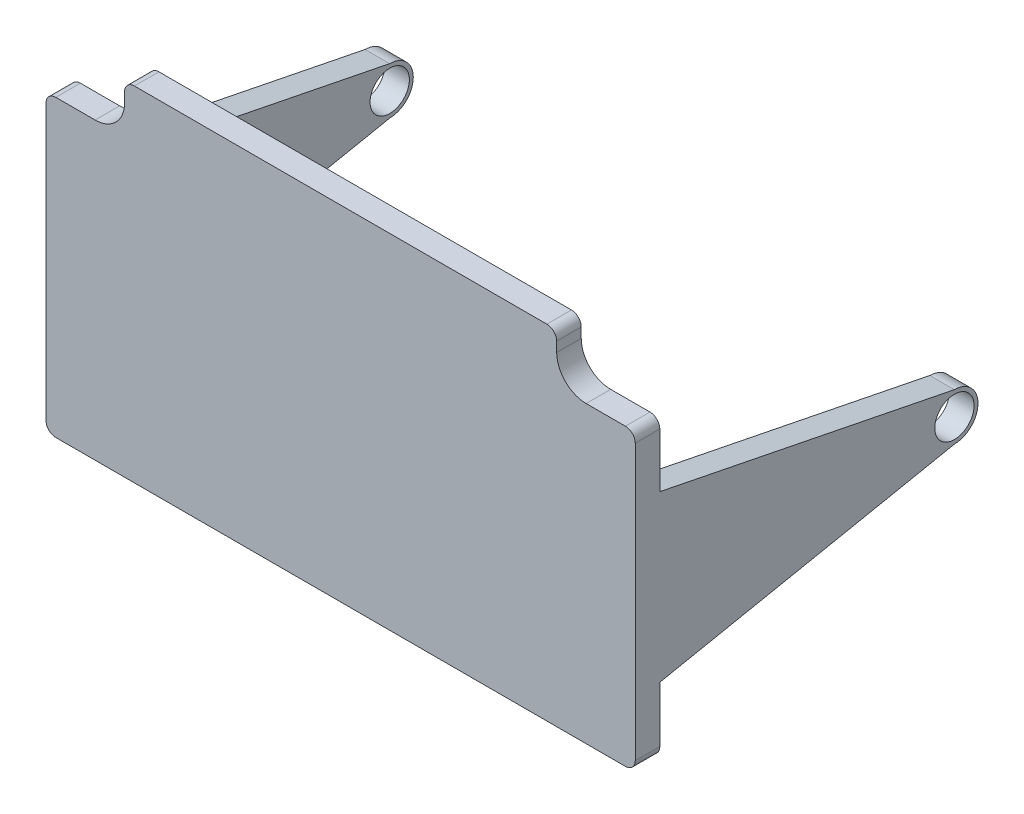
ISO-10303-21;
HEADER;
FILE_DESCRIPTION(('STEP AP214'),'2;1');
FILE_NAME('part.step','',(''),(''),'','','');
FILE_SCHEMA(('AUTOMOTIVE_DESIGN { 1 0 10303 214 1 1 1 1 }'));
ENDSEC;
DATA;
#1=APPLICATION_CONTEXT('core data for automotive mechanical design processes');
#2=APPLICATION_PROTOCOL_DEFINITION('international standard','automotive_design',2000,#1);
#3=PRODUCT_CONTEXT('',#1,'mechanical');
#4=PRODUCT('Part','Part','',(#3));
#5=PRODUCT_RELATED_PRODUCT_CATEGORY('part','',(#4));
#6=PRODUCT_DEFINITION_FORMATION('','',#4);
#7=PRODUCT_DEFINITION_CONTEXT('part definition',#1,'design');
#8=PRODUCT_DEFINITION('design','',#6,#7);
#9=PRODUCT_DEFINITION_SHAPE('','',#8);
#10=(LENGTH_UNIT() NAMED_UNIT(*) SI_UNIT(.MILLI.,.METRE.));
#11=(NAMED_UNIT(*) PLANE_ANGLE_UNIT() SI_UNIT($,.RADIAN.));
#12=(NAMED_UNIT(*) SI_UNIT($,.STERADIAN.) SOLID_ANGLE_UNIT());
#13=UNCERTAINTY_MEASURE_WITH_UNIT(LENGTH_MEASURE(1.E-05),#10,'distance_accuracy_value','');
#14=(GEOMETRIC_REPRESENTATION_CONTEXT(3) GLOBAL_UNCERTAINTY_ASSIGNED_CONTEXT((#13)) GLOBAL_UNIT_ASSIGNED_CONTEXT((#10,
#11,#12)) REPRESENTATION_CONTEXT('',''));
#15=CARTESIAN_POINT('',(0.,0.,0.));
#16=DIRECTION('',(0.,0.,1.));
#17=DIRECTION('',(1.,0.,0.));
#18=AXIS2_PLACEMENT_3D('',#15,#16,#17);
#19=CARTESIAN_POINT('',(0.,0.,-32.5));
#20=DIRECTION('',(0.,0.,-1.));
#21=DIRECTION('',(-1.,0.,0.));
#22=AXIS2_PLACEMENT_3D('',#19,#20,#21);
#23=PLANE('',#22);
#24=DIRECTION('',(-1.,0.,0.));
#25=VECTOR('',#24,1.);
#26=CARTESIAN_POINT('',(-27.5,-2.32890700780279,-32.5));
#27=LINE('',#26,#25);
#28=CARTESIAN_POINT('',(-27.5,-2.32890700780279,-32.5));
#29=VERTEX_POINT('',#28);
#30=CARTESIAN_POINT('',(-30.,-2.32890700780279,-32.5));
#31=VERTEX_POINT('',#30);
#32=EDGE_CURVE('E49',#29,#31,#27,.T.);
#33=ORIENTED_EDGE('',*,*,#32,.F.);
#34=DIRECTION('',(0.,-1.,0.));
#35=VECTOR('',#34,1.);
#36=CARTESIAN_POINT('',(-27.5,2.47490839214315,-32.5));
#37=LINE('',#36,#35);
#38=CARTESIAN_POINT('',(-27.5,-2.33272240774873,-32.5));
#39=VERTEX_POINT('',#38);
#40=EDGE_CURVE('E234',#29,#39,#37,.T.);
#41=ORIENTED_EDGE('',*,*,#40,.T.);
#42=DIRECTION('',(-1.,0.,0.));
#43=VECTOR('',#42,1.);
#44=CARTESIAN_POINT('',(-27.5,-2.33272240774874,-32.5));
#45=LINE('',#44,#43);
#46=CARTESIAN_POINT('',(-30.,-2.33272240774874,-32.5));
#47=VERTEX_POINT('',#46);
#48=EDGE_CURVE('E221',#39,#47,#45,.T.);
#49=ORIENTED_EDGE('',*,*,#48,.T.);
#50=DIRECTION('',(0.,1.,0.));
#51=VECTOR('',#50,1.);
#52=CARTESIAN_POINT('',(-30.,-2.33272240774874,-32.5));
#53=LINE('',#52,#51);
#54=EDGE_CURVE('E243',#47,#31,#53,.T.);
#55=ORIENTED_EDGE('',*,*,#54,.T.);
#56=EDGE_LOOP('',(#33,#41,#49,#55));
#57=FACE_BOUND('',#56,.T.);
#58=ADVANCED_FACE('F33',(#57),#23,.T.);
#59=CARTESIAN_POINT('',(0.,0.,-32.5));
#60=DIRECTION('',(0.,0.,1.));
#61=DIRECTION('',(1.,0.,0.));
#62=AXIS2_PLACEMENT_3D('',#59,#60,#61);
#63=PLANE('',#62);
#64=DIRECTION('',(0.,1.,0.));
#65=VECTOR('',#64,1.);
#66=CARTESIAN_POINT('',(27.5,2.47490839214314,-32.5));
#67=LINE('',#66,#65);
#68=CARTESIAN_POINT('',(27.5,-2.33272240774873,-32.5));
#69=VERTEX_POINT('',#68);
#70=CARTESIAN_POINT('',(27.5,-2.32890700780279,-32.5));
#71=VERTEX_POINT('',#70);
#72=EDGE_CURVE('E436',#69,#71,#67,.T.);
#73=ORIENTED_EDGE('',*,*,#72,.T.);
#74=DIRECTION('',(1.,0.,0.));
#75=VECTOR('',#74,1.);
#76=CARTESIAN_POINT('',(27.5,-2.32890700780279,-32.5));
#77=LINE('',#76,#75);
#78=CARTESIAN_POINT('',(30.,-2.32890700780279,-32.5));
#79=VERTEX_POINT('',#78);
#80=EDGE_CURVE('E427',#71,#79,#77,.T.);
#81=ORIENTED_EDGE('',*,*,#80,.T.);
#82=DIRECTION('',(0.,-1.,0.));
#83=VECTOR('',#82,1.);
#84=CARTESIAN_POINT('',(30.,-2.33272240774873,-32.5));
#85=LINE('',#84,#83);
#86=CARTESIAN_POINT('',(30.,-2.33272240774873,-32.5));
#87=VERTEX_POINT('',#86);
#88=EDGE_CURVE('E442',#79,#87,#85,.T.);
#89=ORIENTED_EDGE('',*,*,#88,.T.);
#90=DIRECTION('',(-1.,0.,0.));
#91=VECTOR('',#90,1.);
#92=CARTESIAN_POINT('',(27.5,-2.33272240774873,-32.5));
#93=LINE('',#92,#91);
#94=EDGE_CURVE('E249',#87,#69,#93,.T.);
#95=ORIENTED_EDGE('',*,*,#94,.T.);
#96=EDGE_LOOP('',(#73,#81,#89,#95));
#97=FACE_BOUND('',#96,.T.);
#98=ADVANCED_FACE('F491',(#97),#63,.F.);
#99=CARTESIAN_POINT('',(25.,18.,-2.5));
#100=DIRECTION('',(0.,0.,-1.));
#101=DIRECTION('',(-1.,0.,0.));
#102=AXIS2_PLACEMENT_3D('',#99,#100,#101);
#103=PLANE('',#102);
#104=DIRECTION('',(-1.,0.,0.));
#105=VECTOR('',#104,1.);
#106=CARTESIAN_POINT('',(-27.5,-8.33272240774873,-2.5));
#107=LINE('',#106,#105);
#108=CARTESIAN_POINT('',(-27.5,-8.33272240774873,-2.5));
#109=VERTEX_POINT('',#108);
#110=CARTESIAN_POINT('',(-30.,-8.33272240774873,-2.5));
#111=VERTEX_POINT('',#110);
#112=EDGE_CURVE('E401',#109,#111,#107,.T.);
#113=ORIENTED_EDGE('',*,*,#112,.F.);
#114=DIRECTION('',(0.,-1.,0.));
#115=VECTOR('',#114,1.);
#116=CARTESIAN_POINT('',(-27.5,2.47490839214315,-2.5));
#117=LINE('',#116,#115);
#118=CARTESIAN_POINT('',(-27.5,8.47490839214315,-2.5));
#119=VERTEX_POINT('',#118);
#120=EDGE_CURVE('E237',#119,#109,#117,.T.);
#121=ORIENTED_EDGE('',*,*,#120,.F.);
#122=DIRECTION('',(-1.,0.,0.));
#123=VECTOR('',#122,1.);
#124=CARTESIAN_POINT('',(-27.5,8.47490839214315,-2.5));
#125=LINE('',#124,#123);
#126=CARTESIAN_POINT('',(-30.,8.47490839214315,-2.5));
#127=VERTEX_POINT('',#126);
#128=EDGE_CURVE('E404',#119,#127,#125,.T.);
#129=ORIENTED_EDGE('',*,*,#128,.T.);
#130=DIRECTION('',(0.,-1.,0.));
#131=VECTOR('',#130,1.);
#132=CARTESIAN_POINT('',(-30.,-15.,-2.5));
#133=LINE('',#132,#131);
#134=CARTESIAN_POINT('',(-30.,14.,-2.5));
#135=VERTEX_POINT('',#134);
#136=EDGE_CURVE('E255',#135,#127,#133,.T.);
#137=ORIENTED_EDGE('',*,*,#136,.F.);
#138=CARTESIAN_POINT('',(-29.,14.,-2.5));
#139=DIRECTION('',(0.,0.,-1.));
#140=DIRECTION('',(-1.,0.,0.));
#141=AXIS2_PLACEMENT_3D('',#138,#139,#140);
#142=CIRCLE('',#141,1.);
#143=CARTESIAN_POINT('',(-29.,15.,-2.5));
#144=VERTEX_POINT('',#143);
#145=EDGE_CURVE('E359',#135,#144,#142,.T.);
#146=ORIENTED_EDGE('',*,*,#145,.T.);
#147=DIRECTION('',(-1.,0.,0.));
#148=VECTOR('',#147,1.);
#149=CARTESIAN_POINT('',(-25.,15.,-2.5));
#150=LINE('',#149,#148);
#151=CARTESIAN_POINT('',(-25.,15.,-2.5));
#152=VERTEX_POINT('',#151);
#153=EDGE_CURVE('E250',#152,#144,#150,.T.);
#154=ORIENTED_EDGE('',*,*,#153,.F.);
#155=CARTESIAN_POINT('',(-25.,18.,-2.5));
#156=DIRECTION('',(0.,0.,-1.));
#157=DIRECTION('',(1.,0.,0.));
#158=AXIS2_PLACEMENT_3D('',#155,#156,#157);
#159=CIRCLE('',#158,3.);
#160=CARTESIAN_POINT('',(-22.,18.,-2.5));
#161=VERTEX_POINT('',#160);
#162=EDGE_CURVE('E278',#161,#152,#159,.T.);
#163=ORIENTED_EDGE('',*,*,#162,.F.);
#164=DIRECTION('',(0.,-1.,0.));
#165=VECTOR('',#164,1.);
#166=CARTESIAN_POINT('',(-22.,18.,-2.5));
#167=LINE('',#166,#165);
#168=CARTESIAN_POINT('',(-22.,19.,-2.5));
#169=VERTEX_POINT('',#168);
#170=EDGE_CURVE('E276',#169,#161,#167,.T.);
#171=ORIENTED_EDGE('',*,*,#170,.F.);
#172=CARTESIAN_POINT('',(-21.,19.,-2.5));
#173=DIRECTION('',(0.,0.,-1.));
#174=DIRECTION('',(-1.,0.,0.));
#175=AXIS2_PLACEMENT_3D('',#172,#173,#174);
#176=CIRCLE('',#175,1.);
#177=CARTESIAN_POINT('',(-21.,20.,-2.5));
#178=VERTEX_POINT('',#177);
#179=EDGE_CURVE('E329',#169,#178,#176,.T.);
#180=ORIENTED_EDGE('',*,*,#179,.T.);
#181=DIRECTION('',(-1.,0.,0.));
#182=VECTOR('',#181,1.);
#183=CARTESIAN_POINT('',(-22.,20.,-2.5));
#184=LINE('',#183,#182);
#185=CARTESIAN_POINT('',(21.,20.,-2.5));
#186=VERTEX_POINT('',#185);
#187=EDGE_CURVE('E273',#186,#178,#184,.T.);
#188=ORIENTED_EDGE('',*,*,#187,.F.);
#189=CARTESIAN_POINT('',(21.,19.,-2.5));
#190=DIRECTION('',(0.,0.,-1.));
#191=DIRECTION('',(-1.,0.,0.));
#192=AXIS2_PLACEMENT_3D('',#189,#190,#191);
#193=CIRCLE('',#192,1.);
#194=CARTESIAN_POINT('',(22.,19.,-2.5));
#195=VERTEX_POINT('',#194);
#196=EDGE_CURVE('E331',#186,#195,#193,.T.);
#197=ORIENTED_EDGE('',*,*,#196,.T.);
#198=DIRECTION('',(0.,1.,0.));
#199=VECTOR('',#198,1.);
#200=CARTESIAN_POINT('',(22.,20.,-2.5));
#201=LINE('',#200,#199);
#202=CARTESIAN_POINT('',(22.,18.,-2.5));
#203=VERTEX_POINT('',#202);
#204=EDGE_CURVE('E270',#203,#195,#201,.T.);
#205=ORIENTED_EDGE('',*,*,#204,.F.);
#206=CARTESIAN_POINT('',(25.,18.,-2.5));
#207=DIRECTION('',(0.,0.,-1.));
#208=DIRECTION('',(-1.,0.,0.));
#209=AXIS2_PLACEMENT_3D('',#206,#207,#208);
#210=CIRCLE('',#209,3.);
#211=CARTESIAN_POINT('',(25.,15.,-2.5));
#212=VERTEX_POINT('',#211);
#213=EDGE_CURVE('E267',#212,#203,#210,.T.);
#214=ORIENTED_EDGE('',*,*,#213,.F.);
#215=DIRECTION('',(-1.,0.,0.));
#216=VECTOR('',#215,1.);
#217=CARTESIAN_POINT('',(30.,15.,-2.5));
#218=LINE('',#217,#216);
#219=CARTESIAN_POINT('',(29.,15.,-2.5));
#220=VERTEX_POINT('',#219);
#221=EDGE_CURVE('E265',#220,#212,#218,.T.);
#222=ORIENTED_EDGE('',*,*,#221,.F.);
#223=CARTESIAN_POINT('',(29.,14.,-2.5));
#224=DIRECTION('',(0.,0.,-1.));
#225=DIRECTION('',(-1.,0.,0.));
#226=AXIS2_PLACEMENT_3D('',#223,#224,#225);
#227=CIRCLE('',#226,1.);
#228=CARTESIAN_POINT('',(30.,14.,-2.5));
#229=VERTEX_POINT('',#228);
#230=EDGE_CURVE('E351',#220,#229,#227,.T.);
#231=ORIENTED_EDGE('',*,*,#230,.T.);
#232=DIRECTION('',(0.,1.,0.));
#233=VECTOR('',#232,1.);
#234=CARTESIAN_POINT('',(30.,-15.,-2.5));
#235=LINE('',#234,#233);
#236=CARTESIAN_POINT('',(30.,8.47490839214315,-2.5));
#237=VERTEX_POINT('',#236);
#238=EDGE_CURVE('E261',#237,#229,#235,.T.);
#239=ORIENTED_EDGE('',*,*,#238,.F.);
#240=DIRECTION('',(1.,0.,0.));
#241=VECTOR('',#240,1.);
#242=CARTESIAN_POINT('',(27.5,8.47490839214315,-2.5));
#243=LINE('',#242,#241);
#244=CARTESIAN_POINT('',(27.5,8.47490839214315,-2.5));
#245=VERTEX_POINT('',#244);
#246=EDGE_CURVE('E432',#245,#237,#243,.T.);
#247=ORIENTED_EDGE('',*,*,#246,.F.);
#248=DIRECTION('',(0.,1.,0.));
#249=VECTOR('',#248,1.);
#250=CARTESIAN_POINT('',(27.5,2.47490839214314,-2.5));
#251=LINE('',#250,#249);
#252=CARTESIAN_POINT('',(27.5,-8.33272240774873,-2.5));
#253=VERTEX_POINT('',#252);
#254=EDGE_CURVE('E430',#253,#245,#251,.T.);
#255=ORIENTED_EDGE('',*,*,#254,.F.);
#256=DIRECTION('',(1.,0.,0.));
#257=VECTOR('',#256,1.);
#258=CARTESIAN_POINT('',(27.5,-8.33272240774873,-2.5));
#259=LINE('',#258,#257);
#260=CARTESIAN_POINT('',(30.,-8.33272240774873,-2.5));
#261=VERTEX_POINT('',#260);
#262=EDGE_CURVE('E383',#253,#261,#259,.T.);
#263=ORIENTED_EDGE('',*,*,#262,.T.);
#264=CARTESIAN_POINT('',(30.,-14.,-2.5));
#265=VERTEX_POINT('',#264);
#266=EDGE_CURVE('E262',#265,#261,#235,.T.);
#267=ORIENTED_EDGE('',*,*,#266,.F.);
#268=CARTESIAN_POINT('',(29.,-14.,-2.5));
#269=DIRECTION('',(0.,0.,-1.));
#270=DIRECTION('',(-1.,0.,0.));
#271=AXIS2_PLACEMENT_3D('',#268,#269,#270);
#272=CIRCLE('',#271,1.);
#273=CARTESIAN_POINT('',(29.,-15.,-2.5));
#274=VERTEX_POINT('',#273);
#275=EDGE_CURVE('E354',#265,#274,#272,.T.);
#276=ORIENTED_EDGE('',*,*,#275,.T.);
#277=DIRECTION('',(1.,0.,0.));
#278=VECTOR('',#277,1.);
#279=CARTESIAN_POINT('',(30.,-15.,-2.5));
#280=LINE('',#279,#278);
#281=CARTESIAN_POINT('',(-29.,-15.,-2.5));
#282=VERTEX_POINT('',#281);
#283=EDGE_CURVE('E258',#282,#274,#280,.T.);
#284=ORIENTED_EDGE('',*,*,#283,.F.);
#285=CARTESIAN_POINT('',(-29.,-14.,-2.5));
#286=DIRECTION('',(0.,0.,-1.));
#287=DIRECTION('',(-1.,0.,0.));
#288=AXIS2_PLACEMENT_3D('',#285,#286,#287);
#289=CIRCLE('',#288,1.);
#290=CARTESIAN_POINT('',(-30.,-14.,-2.5));
#291=VERTEX_POINT('',#290);
#292=EDGE_CURVE('E356',#282,#291,#289,.T.);
#293=ORIENTED_EDGE('',*,*,#292,.T.);
#294=EDGE_CURVE('E253',#111,#291,#133,.T.);
#295=ORIENTED_EDGE('',*,*,#294,.F.);
#296=EDGE_LOOP('',(#113,#121,#129,#137,#146,#154,#163,#171,#180,#188,#197,#205,#214,#222,#231,
#239,#247,#255,#263,#267,#276,#284,#293,#295));
#297=FACE_BOUND('',#296,.T.);
#298=ADVANCED_FACE('F380',(#297),#103,.T.);
#299=CARTESIAN_POINT('',(-25.,15.,-2.5));
#300=DIRECTION('',(0.,1.,0.));
#301=DIRECTION('',(-1.,0.,0.));
#302=AXIS2_PLACEMENT_3D('',#299,#300,#301);
#303=PLANE('',#302);
#304=ORIENTED_EDGE('',*,*,#153,.T.);
#305=DIRECTION('',(0.,0.,1.));
#306=VECTOR('',#305,1.);
#307=CARTESIAN_POINT('',(-29.,15.,-2.5));
#308=LINE('',#307,#306);
#309=CARTESIAN_POINT('',(-29.,15.,0.));
#310=VERTEX_POINT('',#309);
#311=EDGE_CURVE('E335',#144,#310,#308,.T.);
#312=ORIENTED_EDGE('',*,*,#311,.T.);
#313=DIRECTION('',(-1.,0.,0.));
#314=VECTOR('',#313,1.);
#315=CARTESIAN_POINT('',(-25.,15.,0.));
#316=LINE('',#315,#314);
#317=CARTESIAN_POINT('',(-25.,15.,0.));
#318=VERTEX_POINT('',#317);
#319=EDGE_CURVE('E229',#318,#310,#316,.T.);
#320=ORIENTED_EDGE('',*,*,#319,.F.);
#321=DIRECTION('',(0.,0.,1.));
#322=VECTOR('',#321,1.);
#323=CARTESIAN_POINT('',(-25.,15.,-2.5));
#324=LINE('',#323,#322);
#325=EDGE_CURVE('E308',#152,#318,#324,.T.);
#326=ORIENTED_EDGE('',*,*,#325,.F.);
#327=EDGE_LOOP('',(#304,#312,#320,#326));
#328=FACE_BOUND('',#327,.T.);
#329=ADVANCED_FACE('F514',(#328),#303,.T.);
#330=CARTESIAN_POINT('',(-25.,18.,-2.5));
#331=DIRECTION('',(0.,0.,1.));
#332=DIRECTION('',(1.,0.,0.));
#333=AXIS2_PLACEMENT_3D('',#330,#331,#332);
#334=CYLINDRICAL_SURFACE('',#333,3.);
#335=CARTESIAN_POINT('',(-25.,18.,0.));
#336=DIRECTION('',(0.,0.,-1.));
#337=DIRECTION('',(1.,0.,0.));
#338=AXIS2_PLACEMENT_3D('',#335,#336,#337);
#339=CIRCLE('',#338,3.);
#340=CARTESIAN_POINT('',(-22.,18.,0.));
#341=VERTEX_POINT('',#340);
#342=EDGE_CURVE('E254',#341,#318,#339,.T.);
#343=ORIENTED_EDGE('',*,*,#342,.F.);
#344=DIRECTION('',(0.,0.,1.));
#345=VECTOR('',#344,1.);
#346=CARTESIAN_POINT('',(-22.,18.,-2.5));
#347=LINE('',#346,#345);
#348=EDGE_CURVE('E311',#161,#341,#347,.T.);
#349=ORIENTED_EDGE('',*,*,#348,.F.);
#350=ORIENTED_EDGE('',*,*,#162,.T.);
#351=ORIENTED_EDGE('',*,*,#325,.T.);
#352=EDGE_LOOP('',(#343,#349,#350,#351));
#353=FACE_BOUND('',#352,.T.);
#354=ADVANCED_FACE('F518',(#353),#334,.F.);
#355=CARTESIAN_POINT('',(-22.,18.,-2.5));
#356=DIRECTION('',(-1.,0.,0.));
#357=DIRECTION('',(0.,-1.,0.));
#358=AXIS2_PLACEMENT_3D('',#355,#356,#357);
#359=PLANE('',#358);
#360=DIRECTION('',(0.,-1.,0.));
#361=VECTOR('',#360,1.);
#362=CARTESIAN_POINT('',(-22.,18.,0.));
#363=LINE('',#362,#361);
#364=CARTESIAN_POINT('',(-22.,19.,0.));
#365=VERTEX_POINT('',#364);
#366=EDGE_CURVE('E304',#365,#341,#363,.T.);
#367=ORIENTED_EDGE('',*,*,#366,.F.);
#368=DIRECTION('',(0.,0.,1.));
#369=VECTOR('',#368,1.);
#370=CARTESIAN_POINT('',(-22.,19.,-2.5));
#371=LINE('',#370,#369);
#372=EDGE_CURVE('E333',#365,#169,#371,.F.);
#373=ORIENTED_EDGE('',*,*,#372,.T.);
#374=ORIENTED_EDGE('',*,*,#170,.T.);
#375=ORIENTED_EDGE('',*,*,#348,.T.);
#376=EDGE_LOOP('',(#367,#373,#374,#375));
#377=FACE_BOUND('',#376,.T.);
#378=ADVANCED_FACE('F521',(#377),#359,.T.);
#379=CARTESIAN_POINT('',(-22.,20.,-2.5));
#380=DIRECTION('',(0.,1.,0.));
#381=DIRECTION('',(-1.,0.,0.));
#382=AXIS2_PLACEMENT_3D('',#379,#380,#381);
#383=PLANE('',#382);
#384=DIRECTION('',(-1.,0.,0.));
#385=VECTOR('',#384,1.);
#386=CARTESIAN_POINT('',(-22.,20.,0.));
#387=LINE('',#386,#385);
#388=CARTESIAN_POINT('',(21.,20.,0.));
#389=VERTEX_POINT('',#388);
#390=CARTESIAN_POINT('',(-21.,20.,0.));
#391=VERTEX_POINT('',#390);
#392=EDGE_CURVE('E301',#389,#391,#387,.T.);
#393=ORIENTED_EDGE('',*,*,#392,.F.);
#394=DIRECTION('',(0.,0.,1.));
#395=VECTOR('',#394,1.);
#396=CARTESIAN_POINT('',(21.,20.,-2.5));
#397=LINE('',#396,#395);
#398=EDGE_CURVE('E327',#389,#186,#397,.F.);
#399=ORIENTED_EDGE('',*,*,#398,.T.);
#400=ORIENTED_EDGE('',*,*,#187,.T.);
#401=DIRECTION('',(0.,0.,1.));
#402=VECTOR('',#401,1.);
#403=CARTESIAN_POINT('',(-21.,20.,-2.5));
#404=LINE('',#403,#402);
#405=EDGE_CURVE('E324',#178,#391,#404,.T.);
#406=ORIENTED_EDGE('',*,*,#405,.T.);
#407=EDGE_LOOP('',(#393,#399,#400,#406));
#408=FACE_BOUND('',#407,.T.);
#409=ADVANCED_FACE('F525',(#408),#383,.T.);
#410=CARTESIAN_POINT('',(22.,20.,-2.5));
#411=DIRECTION('',(1.,0.,0.));
#412=DIRECTION('',(0.,1.,0.));
#413=AXIS2_PLACEMENT_3D('',#410,#411,#412);
#414=PLANE('',#413);
#415=ORIENTED_EDGE('',*,*,#204,.T.);
#416=DIRECTION('',(0.,0.,1.));
#417=VECTOR('',#416,1.);
#418=CARTESIAN_POINT('',(22.,19.,-2.5));
#419=LINE('',#418,#417);
#420=CARTESIAN_POINT('',(22.,19.,0.));
#421=VERTEX_POINT('',#420);
#422=EDGE_CURVE('E310',#195,#421,#419,.T.);
#423=ORIENTED_EDGE('',*,*,#422,.T.);
#424=DIRECTION('',(0.,1.,0.));
#425=VECTOR('',#424,1.);
#426=CARTESIAN_POINT('',(22.,20.,0.));
#427=LINE('',#426,#425);
#428=CARTESIAN_POINT('',(22.,18.,0.));
#429=VERTEX_POINT('',#428);
#430=EDGE_CURVE('E298',#429,#421,#427,.T.);
#431=ORIENTED_EDGE('',*,*,#430,.F.);
#432=DIRECTION('',(0.,0.,1.));
#433=VECTOR('',#432,1.);
#434=CARTESIAN_POINT('',(22.,18.,-2.5));
#435=LINE('',#434,#433);
#436=EDGE_CURVE('E314',#203,#429,#435,.T.);
#437=ORIENTED_EDGE('',*,*,#436,.F.);
#438=EDGE_LOOP('',(#415,#423,#431,#437));
#439=FACE_BOUND('',#438,.T.);
#440=ADVANCED_FACE('F529',(#439),#414,.T.);
#441=CARTESIAN_POINT('',(25.,18.,-2.5));
#442=DIRECTION('',(0.,0.,1.));
#443=DIRECTION('',(1.,0.,0.));
#444=AXIS2_PLACEMENT_3D('',#441,#442,#443);
#445=CYLINDRICAL_SURFACE('',#444,3.);
#446=CARTESIAN_POINT('',(25.,18.,0.));
#447=DIRECTION('',(0.,0.,-1.));
#448=DIRECTION('',(-1.,0.,0.));
#449=AXIS2_PLACEMENT_3D('',#446,#447,#448);
#450=CIRCLE('',#449,3.);
#451=CARTESIAN_POINT('',(25.,15.,0.));
#452=VERTEX_POINT('',#451);
#453=EDGE_CURVE('E295',#452,#429,#450,.T.);
#454=ORIENTED_EDGE('',*,*,#453,.F.);
#455=DIRECTION('',(0.,0.,1.));
#456=VECTOR('',#455,1.);
#457=CARTESIAN_POINT('',(25.,15.,-2.5));
#458=LINE('',#457,#456);
#459=EDGE_CURVE('E281',#212,#452,#458,.T.);
#460=ORIENTED_EDGE('',*,*,#459,.F.);
#461=ORIENTED_EDGE('',*,*,#213,.T.);
#462=ORIENTED_EDGE('',*,*,#436,.T.);
#463=EDGE_LOOP('',(#454,#460,#461,#462));
#464=FACE_BOUND('',#463,.T.);
#465=ADVANCED_FACE('F533',(#464),#445,.F.);
#466=CARTESIAN_POINT('',(30.,15.,-2.5));
#467=DIRECTION('',(0.,1.,0.));
#468=DIRECTION('',(-1.,0.,0.));
#469=AXIS2_PLACEMENT_3D('',#466,#467,#468);
#470=PLANE('',#469);
#471=DIRECTION('',(-1.,0.,0.));
#472=VECTOR('',#471,1.);
#473=CARTESIAN_POINT('',(30.,15.,0.));
#474=LINE('',#473,#472);
#475=CARTESIAN_POINT('',(29.,15.,0.));
#476=VERTEX_POINT('',#475);
#477=EDGE_CURVE('E293',#476,#452,#474,.T.);
#478=ORIENTED_EDGE('',*,*,#477,.F.);
#479=DIRECTION('',(0.,0.,1.));
#480=VECTOR('',#479,1.);
#481=CARTESIAN_POINT('',(29.,15.,-2.5));
#482=LINE('',#481,#480);
#483=EDGE_CURVE('E11',#476,#220,#482,.F.);
#484=ORIENTED_EDGE('',*,*,#483,.T.);
#485=ORIENTED_EDGE('',*,*,#221,.T.);
#486=ORIENTED_EDGE('',*,*,#459,.T.);
#487=EDGE_LOOP('',(#478,#484,#485,#486));
#488=FACE_BOUND('',#487,.T.);
#489=ADVANCED_FACE('F537',(#488),#470,.T.);
#490=CARTESIAN_POINT('',(30.,-15.,-2.5));
#491=DIRECTION('',(1.,0.,0.));
#492=DIRECTION('',(0.,0.,-1.));
#493=AXIS2_PLACEMENT_3D('',#490,#491,#492);
#494=PLANE('',#493);
#495=CARTESIAN_POINT('',(30.,0.0710929921972072,-32.5));
#496=DIRECTION('',(1.,0.,0.));
#497=DIRECTION('',(0.,0.,-1.));
#498=AXIS2_PLACEMENT_3D('',#495,#496,#497);
#499=CIRCLE('',#498,2.);
#500=CARTESIAN_POINT('',(30.,0.0710929921972072,-34.5));
#501=VERTEX_POINT('',#500);
#502=EDGE_CURVE('E468',#501,#501,#499,.T.);
#503=ORIENTED_EDGE('',*,*,#502,.F.);
#504=EDGE_LOOP('',(#503));
#505=FACE_BOUND('',#504,.T.);
#506=DIRECTION('',(0.,0.196116135138184,0.98058067569092));
#507=VECTOR('',#506,1.);
#508=CARTESIAN_POINT('',(30.,8.47490839214315,-2.5));
#509=LINE('',#508,#507);
#510=CARTESIAN_POINT('',(30.,2.47490839214314,-32.5));
#511=VERTEX_POINT('',#510);
#512=EDGE_CURVE('E424',#511,#237,#509,.T.);
#513=ORIENTED_EDGE('',*,*,#512,.T.);
#514=ORIENTED_EDGE('',*,*,#238,.T.);
#515=DIRECTION('',(0.,0.,1.));
#516=VECTOR('',#515,1.);
#517=CARTESIAN_POINT('',(30.,14.,-2.5));
#518=LINE('',#517,#516);
#519=CARTESIAN_POINT('',(30.,14.,0.));
#520=VERTEX_POINT('',#519);
#521=EDGE_CURVE('E366',#229,#520,#518,.T.);
#522=ORIENTED_EDGE('',*,*,#521,.T.);
#523=DIRECTION('',(0.,1.,0.));
#524=VECTOR('',#523,1.);
#525=CARTESIAN_POINT('',(30.,-15.,0.));
#526=LINE('',#525,#524);
#527=CARTESIAN_POINT('',(30.,-14.,0.));
#528=VERTEX_POINT('',#527);
#529=EDGE_CURVE('E290',#528,#520,#526,.T.);
#530=ORIENTED_EDGE('',*,*,#529,.F.);
#531=DIRECTION('',(0.,0.,1.));
#532=VECTOR('',#531,1.);
#533=CARTESIAN_POINT('',(30.,-14.,-2.5));
#534=LINE('',#533,#532);
#535=EDGE_CURVE('E42',#528,#265,#534,.F.);
#536=ORIENTED_EDGE('',*,*,#535,.T.);
#537=ORIENTED_EDGE('',*,*,#266,.T.);
#538=DIRECTION('',(0.,0.196116135138184,-0.98058067569092));
#539=VECTOR('',#538,1.);
#540=CARTESIAN_POINT('',(30.,-2.33272240774873,-32.5));
#541=LINE('',#540,#539);
#542=EDGE_CURVE('E416',#261,#87,#541,.T.);
#543=ORIENTED_EDGE('',*,*,#542,.T.);
#544=ORIENTED_EDGE('',*,*,#88,.F.);
#545=CARTESIAN_POINT('',(30.,0.0710929921972072,-32.5));
#546=DIRECTION('',(1.,0.,0.));
#547=DIRECTION('',(0.,0.,-1.));
#548=AXIS2_PLACEMENT_3D('',#545,#546,#547);
#549=CIRCLE('',#548,2.4);
#550=CARTESIAN_POINT('',(30.,2.47109299219721,-32.5));
#551=VERTEX_POINT('',#550);
#552=EDGE_CURVE('E406',#79,#551,#549,.T.);
#553=ORIENTED_EDGE('',*,*,#552,.T.);
#554=EDGE_CURVE('E443',#511,#551,#85,.T.);
#555=ORIENTED_EDGE('',*,*,#554,.F.);
#556=EDGE_LOOP('',(#513,#514,#522,#530,#536,#537,#543,#544,#553,#555));
#557=FACE_BOUND('',#556,.T.);
#558=ADVANCED_FACE('F374',(#505,#557),#494,.T.);
#559=CARTESIAN_POINT('',(30.,-15.,-2.5));
#560=DIRECTION('',(0.,-1.,0.));
#561=DIRECTION('',(1.,0.,0.));
#562=AXIS2_PLACEMENT_3D('',#559,#560,#561);
#563=PLANE('',#562);
#564=DIRECTION('',(1.,0.,0.));
#565=VECTOR('',#564,1.);
#566=CARTESIAN_POINT('',(30.,-15.,0.));
#567=LINE('',#566,#565);
#568=CARTESIAN_POINT('',(-29.,-15.,0.));
#569=VERTEX_POINT('',#568);
#570=CARTESIAN_POINT('',(29.,-15.,0.));
#571=VERTEX_POINT('',#570);
#572=EDGE_CURVE('E287',#569,#571,#567,.T.);
#573=ORIENTED_EDGE('',*,*,#572,.F.);
#574=DIRECTION('',(0.,0.,1.));
#575=VECTOR('',#574,1.);
#576=CARTESIAN_POINT('',(-29.,-15.,-2.5));
#577=LINE('',#576,#575);
#578=EDGE_CURVE('E364',#569,#282,#577,.F.);
#579=ORIENTED_EDGE('',*,*,#578,.T.);
#580=ORIENTED_EDGE('',*,*,#283,.T.);
#581=DIRECTION('',(0.,0.,1.));
#582=VECTOR('',#581,1.);
#583=CARTESIAN_POINT('',(29.,-15.,-2.5));
#584=LINE('',#583,#582);
#585=EDGE_CURVE('E361',#274,#571,#584,.T.);
#586=ORIENTED_EDGE('',*,*,#585,.T.);
#587=EDGE_LOOP('',(#573,#579,#580,#586));
#588=FACE_BOUND('',#587,.T.);
#589=ADVANCED_FACE('F388',(#588),#563,.T.);
#590=CARTESIAN_POINT('',(-30.,-15.,-2.5));
#591=DIRECTION('',(-1.,0.,0.));
#592=DIRECTION('',(0.,0.,1.));
#593=AXIS2_PLACEMENT_3D('',#590,#591,#592);
#594=PLANE('',#593);
#595=CARTESIAN_POINT('',(-30.,0.0710929921972072,-32.5));
#596=DIRECTION('',(-1.,0.,0.));
#597=DIRECTION('',(0.,0.,1.));
#598=AXIS2_PLACEMENT_3D('',#595,#596,#597);
#599=CIRCLE('',#598,2.);
#600=CARTESIAN_POINT('',(-30.,0.0710929921972072,-30.5));
#601=VERTEX_POINT('',#600);
#602=EDGE_CURVE('E456',#601,#601,#599,.T.);
#603=ORIENTED_EDGE('',*,*,#602,.F.);
#604=EDGE_LOOP('',(#603));
#605=FACE_BOUND('',#604,.T.);
#606=DIRECTION('',(0.,-0.196116135138184,0.98058067569092));
#607=VECTOR('',#606,1.);
#608=CARTESIAN_POINT('',(-30.,-2.33272240774873,-32.5));
#609=LINE('',#608,#607);
#610=EDGE_CURVE('E227',#47,#111,#609,.T.);
#611=ORIENTED_EDGE('',*,*,#610,.T.);
#612=ORIENTED_EDGE('',*,*,#294,.T.);
#613=DIRECTION('',(0.,0.,1.));
#614=VECTOR('',#613,1.);
#615=CARTESIAN_POINT('',(-30.,-14.,-2.5));
#616=LINE('',#615,#614);
#617=CARTESIAN_POINT('',(-30.,-14.,0.));
#618=VERTEX_POINT('',#617);
#619=EDGE_CURVE('E346',#291,#618,#616,.T.);
#620=ORIENTED_EDGE('',*,*,#619,.T.);
#621=DIRECTION('',(0.,-1.,0.));
#622=VECTOR('',#621,1.);
#623=CARTESIAN_POINT('',(-30.,-15.,0.));
#624=LINE('',#623,#622);
#625=CARTESIAN_POINT('',(-30.,14.,0.));
#626=VERTEX_POINT('',#625);
#627=EDGE_CURVE('E284',#626,#618,#624,.T.);
#628=ORIENTED_EDGE('',*,*,#627,.F.);
#629=DIRECTION('',(0.,0.,1.));
#630=VECTOR('',#629,1.);
#631=CARTESIAN_POINT('',(-30.,14.,-2.5));
#632=LINE('',#631,#630);
#633=EDGE_CURVE('E349',#626,#135,#632,.F.);
#634=ORIENTED_EDGE('',*,*,#633,.T.);
#635=ORIENTED_EDGE('',*,*,#136,.T.);
#636=DIRECTION('',(0.,-0.196116135138184,-0.98058067569092));
#637=VECTOR('',#636,1.);
#638=CARTESIAN_POINT('',(-30.,8.47490839214315,-2.5));
#639=LINE('',#638,#637);
#640=CARTESIAN_POINT('',(-30.,2.47490839214315,-32.5));
#641=VERTEX_POINT('',#640);
#642=EDGE_CURVE('E453',#127,#641,#639,.T.);
#643=ORIENTED_EDGE('',*,*,#642,.T.);
#644=CARTESIAN_POINT('',(-30.,2.47109299219721,-32.5));
#645=VERTEX_POINT('',#644);
#646=EDGE_CURVE('E248',#645,#641,#53,.T.);
#647=ORIENTED_EDGE('',*,*,#646,.F.);
#648=CARTESIAN_POINT('',(-30.,0.0710929921972098,-32.5));
#649=DIRECTION('',(-1.,0.,0.));
#650=DIRECTION('',(0.,0.,1.));
#651=AXIS2_PLACEMENT_3D('',#648,#649,#650);
#652=CIRCLE('',#651,2.4);
#653=EDGE_CURVE('E452',#645,#31,#652,.T.);
#654=ORIENTED_EDGE('',*,*,#653,.T.);
#655=ORIENTED_EDGE('',*,*,#54,.F.);
#656=EDGE_LOOP('',(#611,#612,#620,#628,#634,#635,#643,#647,#654,#655));
#657=FACE_BOUND('',#656,.T.);
#658=ADVANCED_FACE('F398',(#605,#657),#594,.T.);
#659=CARTESIAN_POINT('',(25.,18.,0.));
#660=DIRECTION('',(0.,0.,-1.));
#661=DIRECTION('',(-1.,0.,0.));
#662=AXIS2_PLACEMENT_3D('',#659,#660,#661);
#663=PLANE('',#662);
#664=ORIENTED_EDGE('',*,*,#319,.T.);
#665=CARTESIAN_POINT('',(-29.,14.,0.));
#666=DIRECTION('',(0.,0.,-1.));
#667=DIRECTION('',(-1.,0.,0.));
#668=AXIS2_PLACEMENT_3D('',#665,#666,#667);
#669=CIRCLE('',#668,1.);
#670=EDGE_CURVE('E344',#310,#626,#669,.F.);
#671=ORIENTED_EDGE('',*,*,#670,.T.);
#672=ORIENTED_EDGE('',*,*,#627,.T.);
#673=CARTESIAN_POINT('',(-29.,-14.,0.));
#674=DIRECTION('',(0.,0.,-1.));
#675=DIRECTION('',(-1.,0.,0.));
#676=AXIS2_PLACEMENT_3D('',#673,#674,#675);
#677=CIRCLE('',#676,1.);
#678=EDGE_CURVE('E342',#618,#569,#677,.F.);
#679=ORIENTED_EDGE('',*,*,#678,.T.);
#680=ORIENTED_EDGE('',*,*,#572,.T.);
#681=CARTESIAN_POINT('',(29.,-14.,0.));
#682=DIRECTION('',(0.,0.,-1.));
#683=DIRECTION('',(-1.,0.,0.));
#684=AXIS2_PLACEMENT_3D('',#681,#682,#683);
#685=CIRCLE('',#684,1.);
#686=EDGE_CURVE('E340',#571,#528,#685,.F.);
#687=ORIENTED_EDGE('',*,*,#686,.T.);
#688=ORIENTED_EDGE('',*,*,#529,.T.);
#689=CARTESIAN_POINT('',(29.,14.,0.));
#690=DIRECTION('',(0.,0.,-1.));
#691=DIRECTION('',(-1.,0.,0.));
#692=AXIS2_PLACEMENT_3D('',#689,#690,#691);
#693=CIRCLE('',#692,1.);
#694=EDGE_CURVE('E338',#520,#476,#693,.F.);
#695=ORIENTED_EDGE('',*,*,#694,.T.);
#696=ORIENTED_EDGE('',*,*,#477,.T.);
#697=ORIENTED_EDGE('',*,*,#453,.T.);
#698=ORIENTED_EDGE('',*,*,#430,.T.);
#699=CARTESIAN_POINT('',(21.,19.,0.));
#700=DIRECTION('',(0.,0.,-1.));
#701=DIRECTION('',(-1.,0.,0.));
#702=AXIS2_PLACEMENT_3D('',#699,#700,#701);
#703=CIRCLE('',#702,1.);
#704=EDGE_CURVE('E322',#421,#389,#703,.F.);
#705=ORIENTED_EDGE('',*,*,#704,.T.);
#706=ORIENTED_EDGE('',*,*,#392,.T.);
#707=CARTESIAN_POINT('',(-21.,19.,0.));
#708=DIRECTION('',(0.,0.,-1.));
#709=DIRECTION('',(-1.,0.,0.));
#710=AXIS2_PLACEMENT_3D('',#707,#708,#709);
#711=CIRCLE('',#710,1.);
#712=EDGE_CURVE('E320',#391,#365,#711,.F.);
#713=ORIENTED_EDGE('',*,*,#712,.T.);
#714=ORIENTED_EDGE('',*,*,#366,.T.);
#715=ORIENTED_EDGE('',*,*,#342,.T.);
#716=EDGE_LOOP('',(#664,#671,#672,#679,#680,#687,#688,#695,#696,#697,#698,#705,#706,#713,#714,#715));
#717=FACE_BOUND('',#716,.T.);
#718=ADVANCED_FACE('F391',(#717),#663,.F.);
#719=CARTESIAN_POINT('',(21.,19.,-2.5));
#720=DIRECTION('',(0.,0.,1.));
#721=DIRECTION('',(1.,0.,0.));
#722=AXIS2_PLACEMENT_3D('',#719,#720,#721);
#723=CYLINDRICAL_SURFACE('',#722,1.);
#724=ORIENTED_EDGE('',*,*,#196,.F.);
#725=ORIENTED_EDGE('',*,*,#398,.F.);
#726=ORIENTED_EDGE('',*,*,#704,.F.);
#727=ORIENTED_EDGE('',*,*,#422,.F.);
#728=EDGE_LOOP('',(#724,#725,#726,#727));
#729=FACE_BOUND('',#728,.T.);
#730=ADVANCED_FACE('F517',(#729),#723,.T.);
#731=CARTESIAN_POINT('',(-21.,19.,-2.5));
#732=DIRECTION('',(0.,0.,1.));
#733=DIRECTION('',(1.,0.,0.));
#734=AXIS2_PLACEMENT_3D('',#731,#732,#733);
#735=CYLINDRICAL_SURFACE('',#734,1.);
#736=ORIENTED_EDGE('',*,*,#179,.F.);
#737=ORIENTED_EDGE('',*,*,#372,.F.);
#738=ORIENTED_EDGE('',*,*,#712,.F.);
#739=ORIENTED_EDGE('',*,*,#405,.F.);
#740=EDGE_LOOP('',(#736,#737,#738,#739));
#741=FACE_BOUND('',#740,.T.);
#742=ADVANCED_FACE('F555',(#741),#735,.T.);
#743=CARTESIAN_POINT('',(-29.,14.,-2.5));
#744=DIRECTION('',(0.,0.,1.));
#745=DIRECTION('',(1.,0.,0.));
#746=AXIS2_PLACEMENT_3D('',#743,#744,#745);
#747=CYLINDRICAL_SURFACE('',#746,1.);
#748=ORIENTED_EDGE('',*,*,#145,.F.);
#749=ORIENTED_EDGE('',*,*,#633,.F.);
#750=ORIENTED_EDGE('',*,*,#670,.F.);
#751=ORIENTED_EDGE('',*,*,#311,.F.);
#752=EDGE_LOOP('',(#748,#749,#750,#751));
#753=FACE_BOUND('',#752,.T.);
#754=ADVANCED_FACE('F559',(#753),#747,.T.);
#755=CARTESIAN_POINT('',(-29.,-14.,-2.5));
#756=DIRECTION('',(0.,0.,1.));
#757=DIRECTION('',(1.,0.,0.));
#758=AXIS2_PLACEMENT_3D('',#755,#756,#757);
#759=CYLINDRICAL_SURFACE('',#758,1.);
#760=ORIENTED_EDGE('',*,*,#292,.F.);
#761=ORIENTED_EDGE('',*,*,#578,.F.);
#762=ORIENTED_EDGE('',*,*,#678,.F.);
#763=ORIENTED_EDGE('',*,*,#619,.F.);
#764=EDGE_LOOP('',(#760,#761,#762,#763));
#765=FACE_BOUND('',#764,.T.);
#766=ADVANCED_FACE('F396',(#765),#759,.T.);
#767=CARTESIAN_POINT('',(29.,-14.,-2.5));
#768=DIRECTION('',(0.,0.,1.));
#769=DIRECTION('',(1.,0.,0.));
#770=AXIS2_PLACEMENT_3D('',#767,#768,#769);
#771=CYLINDRICAL_SURFACE('',#770,1.);
#772=ORIENTED_EDGE('',*,*,#275,.F.);
#773=ORIENTED_EDGE('',*,*,#535,.F.);
#774=ORIENTED_EDGE('',*,*,#686,.F.);
#775=ORIENTED_EDGE('',*,*,#585,.F.);
#776=EDGE_LOOP('',(#772,#773,#774,#775));
#777=FACE_BOUND('',#776,.T.);
#778=ADVANCED_FACE('F385',(#777),#771,.T.);
#779=CARTESIAN_POINT('',(29.,14.,-2.5));
#780=DIRECTION('',(0.,0.,1.));
#781=DIRECTION('',(1.,0.,0.));
#782=AXIS2_PLACEMENT_3D('',#779,#780,#781);
#783=CYLINDRICAL_SURFACE('',#782,1.);
#784=ORIENTED_EDGE('',*,*,#230,.F.);
#785=ORIENTED_EDGE('',*,*,#483,.F.);
#786=ORIENTED_EDGE('',*,*,#694,.F.);
#787=ORIENTED_EDGE('',*,*,#521,.F.);
#788=EDGE_LOOP('',(#784,#785,#786,#787));
#789=FACE_BOUND('',#788,.T.);
#790=ADVANCED_FACE('F35',(#789),#783,.T.);
#791=CARTESIAN_POINT('',(-27.5,2.47490839214315,-32.5));
#792=DIRECTION('',(-1.,0.,0.));
#793=DIRECTION('',(0.,0.,1.));
#794=AXIS2_PLACEMENT_3D('',#791,#792,#793);
#795=PLANE('',#794);
#796=CARTESIAN_POINT('',(-27.5,0.0710929921972072,-32.5));
#797=DIRECTION('',(-1.,0.,0.));
#798=DIRECTION('',(0.,0.,1.));
#799=AXIS2_PLACEMENT_3D('',#796,#797,#798);
#800=CIRCLE('',#799,2.);
#801=CARTESIAN_POINT('',(-27.5,0.0710929921972072,-30.5));
#802=VERTEX_POINT('',#801);
#803=EDGE_CURVE('E460',#802,#802,#800,.T.);
#804=ORIENTED_EDGE('',*,*,#803,.T.);
#805=EDGE_LOOP('',(#804));
#806=FACE_BOUND('',#805,.T.);
#807=ORIENTED_EDGE('',*,*,#120,.T.);
#808=DIRECTION('',(0.,-0.196116135138184,0.98058067569092));
#809=VECTOR('',#808,1.);
#810=CARTESIAN_POINT('',(-27.5,-2.33272240774873,-32.5));
#811=LINE('',#810,#809);
#812=EDGE_CURVE('E224',#39,#109,#811,.T.);
#813=ORIENTED_EDGE('',*,*,#812,.F.);
#814=ORIENTED_EDGE('',*,*,#40,.F.);
#815=CARTESIAN_POINT('',(-27.5,0.0710929921972098,-32.5));
#816=DIRECTION('',(-1.,0.,0.));
#817=DIRECTION('',(0.,0.,1.));
#818=AXIS2_PLACEMENT_3D('',#815,#816,#817);
#819=CIRCLE('',#818,2.4);
#820=CARTESIAN_POINT('',(-27.5,2.47109299219721,-32.5));
#821=VERTEX_POINT('',#820);
#822=EDGE_CURVE('E239',#821,#29,#819,.T.);
#823=ORIENTED_EDGE('',*,*,#822,.F.);
#824=CARTESIAN_POINT('',(-27.5,2.47490839214315,-32.5));
#825=VERTEX_POINT('',#824);
#826=EDGE_CURVE('E57',#825,#821,#37,.T.);
#827=ORIENTED_EDGE('',*,*,#826,.F.);
#828=DIRECTION('',(0.,-0.196116135138184,-0.98058067569092));
#829=VECTOR('',#828,1.);
#830=CARTESIAN_POINT('',(-27.5,8.47490839214315,-2.5));
#831=LINE('',#830,#829);
#832=EDGE_CURVE('E463',#119,#825,#831,.T.);
#833=ORIENTED_EDGE('',*,*,#832,.F.);
#834=EDGE_LOOP('',(#807,#813,#814,#823,#827,#833));
#835=FACE_BOUND('',#834,.T.);
#836=ADVANCED_FACE('F232',(#806,#835),#795,.F.);
#837=DIRECTION('',(-1.,0.,0.));
#838=VECTOR('',#837,1.);
#839=CARTESIAN_POINT('',(-27.5,2.47109299219721,-32.5));
#840=LINE('',#839,#838);
#841=EDGE_CURVE('E238',#821,#645,#840,.T.);
#842=ORIENTED_EDGE('',*,*,#841,.T.);
#843=ORIENTED_EDGE('',*,*,#646,.T.);
#844=DIRECTION('',(1.,0.,0.));
#845=VECTOR('',#844,1.);
#846=CARTESIAN_POINT('',(-30.,2.47490839214315,-32.5));
#847=LINE('',#846,#845);
#848=EDGE_CURVE('E241',#641,#825,#847,.T.);
#849=ORIENTED_EDGE('',*,*,#848,.T.);
#850=ORIENTED_EDGE('',*,*,#826,.T.);
#851=EDGE_LOOP('',(#842,#843,#849,#850));
#852=FACE_BOUND('',#851,.T.);
#853=ADVANCED_FACE('F448',(#852),#23,.T.);
#854=CARTESIAN_POINT('',(27.5,2.47490839214314,-32.5));
#855=DIRECTION('',(1.,0.,0.));
#856=DIRECTION('',(0.,0.,-1.));
#857=AXIS2_PLACEMENT_3D('',#854,#855,#856);
#858=PLANE('',#857);
#859=CARTESIAN_POINT('',(27.5,0.0710929921972072,-32.5));
#860=DIRECTION('',(1.,0.,0.));
#861=DIRECTION('',(0.,0.,-1.));
#862=AXIS2_PLACEMENT_3D('',#859,#860,#861);
#863=CIRCLE('',#862,2.);
#864=CARTESIAN_POINT('',(27.5,0.0710929921972072,-34.5));
#865=VERTEX_POINT('',#864);
#866=EDGE_CURVE('E37',#865,#865,#863,.T.);
#867=ORIENTED_EDGE('',*,*,#866,.T.);
#868=EDGE_LOOP('',(#867));
#869=FACE_BOUND('',#868,.T.);
#870=ORIENTED_EDGE('',*,*,#254,.T.);
#871=DIRECTION('',(0.,0.196116135138184,0.98058067569092));
#872=VECTOR('',#871,1.);
#873=CARTESIAN_POINT('',(27.5,8.47490839214315,-2.5));
#874=LINE('',#873,#872);
#875=CARTESIAN_POINT('',(27.5,2.47490839214315,-32.5));
#876=VERTEX_POINT('',#875);
#877=EDGE_CURVE('E415',#876,#245,#874,.T.);
#878=ORIENTED_EDGE('',*,*,#877,.F.);
#879=CARTESIAN_POINT('',(27.5,2.47109299219721,-32.5));
#880=VERTEX_POINT('',#879);
#881=EDGE_CURVE('E439',#880,#876,#67,.T.);
#882=ORIENTED_EDGE('',*,*,#881,.F.);
#883=CARTESIAN_POINT('',(27.5,0.0710929921972072,-32.5));
#884=DIRECTION('',(1.,0.,0.));
#885=DIRECTION('',(0.,0.,-1.));
#886=AXIS2_PLACEMENT_3D('',#883,#884,#885);
#887=CIRCLE('',#886,2.4);
#888=EDGE_CURVE('E412',#71,#880,#887,.T.);
#889=ORIENTED_EDGE('',*,*,#888,.F.);
#890=ORIENTED_EDGE('',*,*,#72,.F.);
#891=DIRECTION('',(0.,0.196116135138184,-0.98058067569092));
#892=VECTOR('',#891,1.);
#893=CARTESIAN_POINT('',(27.5,-2.33272240774873,-32.5));
#894=LINE('',#893,#892);
#895=EDGE_CURVE('E419',#253,#69,#894,.T.);
#896=ORIENTED_EDGE('',*,*,#895,.F.);
#897=EDGE_LOOP('',(#870,#878,#882,#889,#890,#896));
#898=FACE_BOUND('',#897,.T.);
#899=ADVANCED_FACE('F475',(#869,#898),#858,.F.);
#900=ORIENTED_EDGE('',*,*,#554,.T.);
#901=DIRECTION('',(1.,0.,0.));
#902=VECTOR('',#901,1.);
#903=CARTESIAN_POINT('',(27.5,2.47109299219721,-32.5));
#904=LINE('',#903,#902);
#905=EDGE_CURVE('E421',#880,#551,#904,.T.);
#906=ORIENTED_EDGE('',*,*,#905,.F.);
#907=ORIENTED_EDGE('',*,*,#881,.T.);
#908=DIRECTION('',(1.,0.,0.));
#909=VECTOR('',#908,1.);
#910=CARTESIAN_POINT('',(30.,2.47490839214314,-32.5));
#911=LINE('',#910,#909);
#912=EDGE_CURVE('E438',#876,#511,#911,.T.);
#913=ORIENTED_EDGE('',*,*,#912,.T.);
#914=EDGE_LOOP('',(#900,#906,#907,#913));
#915=FACE_BOUND('',#914,.T.);
#916=ADVANCED_FACE('F498',(#915),#63,.F.);
#917=CARTESIAN_POINT('',(27.5,0.0710929921972072,-32.5));
#918=DIRECTION('',(1.,0.,0.));
#919=DIRECTION('',(0.,0.,-1.));
#920=AXIS2_PLACEMENT_3D('',#917,#918,#919);
#921=CYLINDRICAL_SURFACE('',#920,2.4);
#922=ORIENTED_EDGE('',*,*,#552,.F.);
#923=ORIENTED_EDGE('',*,*,#80,.F.);
#924=ORIENTED_EDGE('',*,*,#888,.T.);
#925=ORIENTED_EDGE('',*,*,#905,.T.);
#926=EDGE_LOOP('',(#922,#923,#924,#925));
#927=FACE_BOUND('',#926,.T.);
#928=ADVANCED_FACE('F591',(#927),#921,.T.);
#929=CARTESIAN_POINT('',(27.5,8.47490839214315,-2.5));
#930=DIRECTION('',(0.,0.98058067569092,-0.196116135138184));
#931=DIRECTION('',(0.,0.196116135138184,0.98058067569092));
#932=AXIS2_PLACEMENT_3D('',#929,#930,#931);
#933=PLANE('',#932);
#934=ORIENTED_EDGE('',*,*,#512,.F.);
#935=ORIENTED_EDGE('',*,*,#912,.F.);
#936=ORIENTED_EDGE('',*,*,#877,.T.);
#937=ORIENTED_EDGE('',*,*,#246,.T.);
#938=EDGE_LOOP('',(#934,#935,#936,#937));
#939=FACE_BOUND('',#938,.T.);
#940=ADVANCED_FACE('F601',(#939),#933,.T.);
#941=CARTESIAN_POINT('',(27.5,-2.33272240774873,-32.5));
#942=DIRECTION('',(0.,-0.98058067569092,-0.196116135138184));
#943=DIRECTION('',(0.,0.196116135138184,-0.98058067569092));
#944=AXIS2_PLACEMENT_3D('',#941,#942,#943);
#945=PLANE('',#944);
#946=ORIENTED_EDGE('',*,*,#542,.F.);
#947=ORIENTED_EDGE('',*,*,#262,.F.);
#948=ORIENTED_EDGE('',*,*,#895,.T.);
#949=ORIENTED_EDGE('',*,*,#94,.F.);
#950=EDGE_LOOP('',(#946,#947,#948,#949));
#951=FACE_BOUND('',#950,.T.);
#952=ADVANCED_FACE('F612',(#951),#945,.T.);
#953=CARTESIAN_POINT('',(-27.5,0.0710929921972098,-32.5));
#954=DIRECTION('',(-1.,0.,0.));
#955=DIRECTION('',(0.,0.,1.));
#956=AXIS2_PLACEMENT_3D('',#953,#954,#955);
#957=CYLINDRICAL_SURFACE('',#956,2.4);
#958=ORIENTED_EDGE('',*,*,#653,.F.);
#959=ORIENTED_EDGE('',*,*,#841,.F.);
#960=ORIENTED_EDGE('',*,*,#822,.T.);
#961=ORIENTED_EDGE('',*,*,#32,.T.);
#962=EDGE_LOOP('',(#958,#959,#960,#961));
#963=FACE_BOUND('',#962,.T.);
#964=ADVANCED_FACE('F621',(#963),#957,.T.);
#965=CARTESIAN_POINT('',(-27.5,-2.33272240774873,-32.5));
#966=DIRECTION('',(0.,-0.98058067569092,-0.196116135138184));
#967=DIRECTION('',(0.,0.196116135138184,-0.98058067569092));
#968=AXIS2_PLACEMENT_3D('',#965,#966,#967);
#969=PLANE('',#968);
#970=ORIENTED_EDGE('',*,*,#610,.F.);
#971=ORIENTED_EDGE('',*,*,#48,.F.);
#972=ORIENTED_EDGE('',*,*,#812,.T.);
#973=ORIENTED_EDGE('',*,*,#112,.T.);
#974=EDGE_LOOP('',(#970,#971,#972,#973));
#975=FACE_BOUND('',#974,.T.);
#976=ADVANCED_FACE('F223',(#975),#969,.T.);
#977=CARTESIAN_POINT('',(-27.5,8.47490839214315,-2.5));
#978=DIRECTION('',(0.,0.98058067569092,-0.196116135138184));
#979=DIRECTION('',(0.,0.196116135138184,0.98058067569092));
#980=AXIS2_PLACEMENT_3D('',#977,#978,#979);
#981=PLANE('',#980);
#982=ORIENTED_EDGE('',*,*,#642,.F.);
#983=ORIENTED_EDGE('',*,*,#128,.F.);
#984=ORIENTED_EDGE('',*,*,#832,.T.);
#985=ORIENTED_EDGE('',*,*,#848,.F.);
#986=EDGE_LOOP('',(#982,#983,#984,#985));
#987=FACE_BOUND('',#986,.T.);
#988=ADVANCED_FACE('F481',(#987),#981,.T.);
#989=CARTESIAN_POINT('',(-70.,0.0710929921972072,-32.5));
#990=DIRECTION('',(1.,0.,0.));
#991=DIRECTION('',(0.,0.,-1.));
#992=AXIS2_PLACEMENT_3D('',#989,#990,#991);
#993=CYLINDRICAL_SURFACE('',#992,2.);
#994=ORIENTED_EDGE('',*,*,#502,.T.);
#995=EDGE_LOOP('',(#994));
#996=FACE_BOUND('',#995,.T.);
#997=ORIENTED_EDGE('',*,*,#866,.F.);
#998=EDGE_LOOP('',(#997));
#999=FACE_BOUND('',#998,.T.);
#1000=ADVANCED_FACE('F478',(#996,#999),#993,.F.);
#1001=ORIENTED_EDGE('',*,*,#602,.T.);
#1002=EDGE_LOOP('',(#1001));
#1003=FACE_BOUND('',#1002,.T.);
#1004=ORIENTED_EDGE('',*,*,#803,.F.);
#1005=EDGE_LOOP('',(#1004));
#1006=FACE_BOUND('',#1005,.T.);
#1007=ADVANCED_FACE('F480',(#1003,#1006),#993,.F.);
#1008=CLOSED_SHELL('',(#58,#98,#298,#329,#354,#378,#409,#440,#465,#489,#558,#589,#658,#718,#730,
#742,#754,#766,#778,#790,#836,#853,#899,#916,#928,#940,#952,#964,#976,#988,#1000,#1007));
#1009=MANIFOLD_SOLID_BREP('B2',#1008);
#1010=ADVANCED_BREP_SHAPE_REPRESENTATION('',(#18,#1009),#14);
#1011=SHAPE_DEFINITION_REPRESENTATION(#9,#1010);
ENDSEC;
END-ISO-10303-21;
